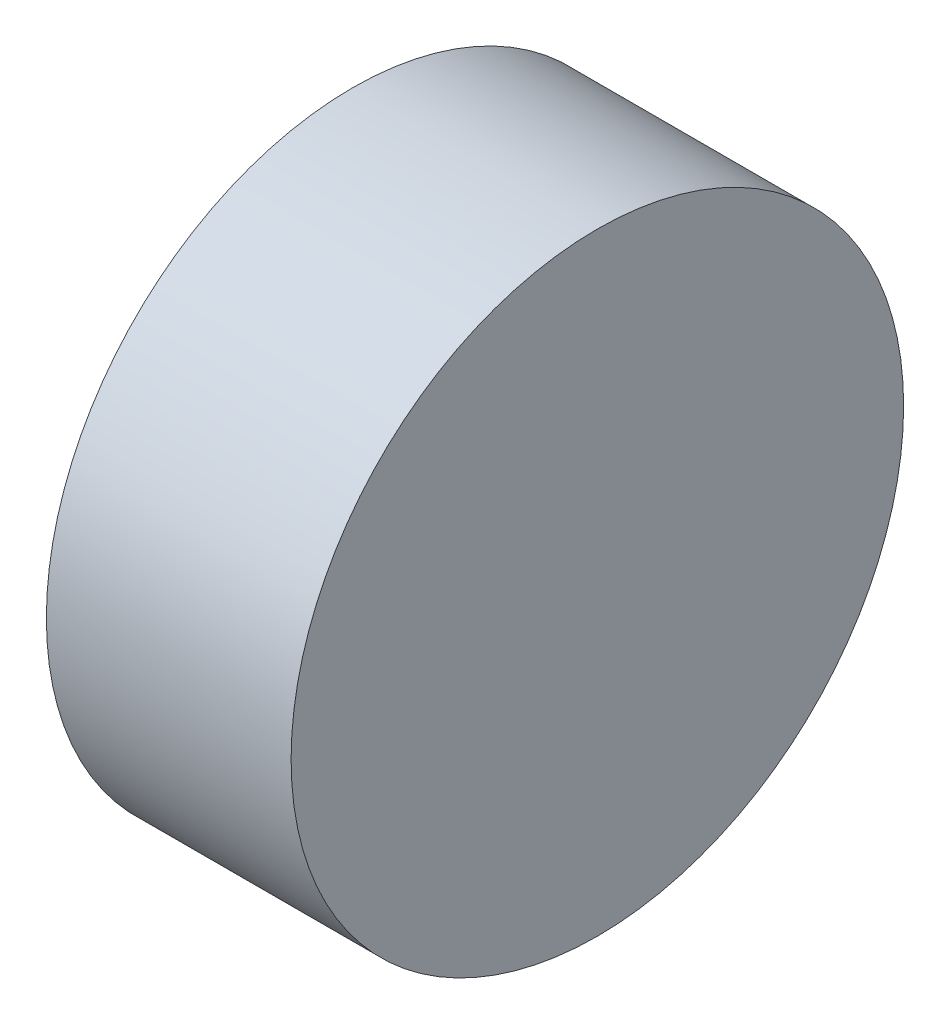
ISO-10303-21;
HEADER;
FILE_DESCRIPTION(('STEP AP214'),'2;1');
FILE_NAME('part.step','',(''),(''),'','','');
FILE_SCHEMA(('AUTOMOTIVE_DESIGN { 1 0 10303 214 1 1 1 1 }'));
ENDSEC;
DATA;
#1=APPLICATION_CONTEXT('core data for automotive mechanical design processes');
#2=APPLICATION_PROTOCOL_DEFINITION('international standard','automotive_design',2000,#1);
#3=PRODUCT_CONTEXT('',#1,'mechanical');
#4=PRODUCT('Part','Part','',(#3));
#5=PRODUCT_RELATED_PRODUCT_CATEGORY('part','',(#4));
#6=PRODUCT_DEFINITION_FORMATION('','',#4);
#7=PRODUCT_DEFINITION_CONTEXT('part definition',#1,'design');
#8=PRODUCT_DEFINITION('design','',#6,#7);
#9=PRODUCT_DEFINITION_SHAPE('','',#8);
#10=(LENGTH_UNIT() NAMED_UNIT(*) SI_UNIT(.MILLI.,.METRE.));
#11=(NAMED_UNIT(*) PLANE_ANGLE_UNIT() SI_UNIT($,.RADIAN.));
#12=(NAMED_UNIT(*) SI_UNIT($,.STERADIAN.) SOLID_ANGLE_UNIT());
#13=UNCERTAINTY_MEASURE_WITH_UNIT(LENGTH_MEASURE(1.E-05),#10,'distance_accuracy_value','');
#14=(GEOMETRIC_REPRESENTATION_CONTEXT(3) GLOBAL_UNCERTAINTY_ASSIGNED_CONTEXT((#13)) GLOBAL_UNIT_ASSIGNED_CONTEXT((#10,
#11,#12)) REPRESENTATION_CONTEXT('',''));
#15=CARTESIAN_POINT('',(0.,0.,0.));
#16=DIRECTION('',(0.,0.,1.));
#17=DIRECTION('',(1.,0.,0.));
#18=AXIS2_PLACEMENT_3D('',#15,#16,#17);
#19=CARTESIAN_POINT('',(17.1,0.,0.));
#20=DIRECTION('',(-1.,0.,0.));
#21=DIRECTION('',(0.,0.,1.));
#22=AXIS2_PLACEMENT_3D('',#19,#20,#21);
#23=CYLINDRICAL_SURFACE('',#22,21.4);
#24=CARTESIAN_POINT('',(17.1,0.,0.));
#25=DIRECTION('',(1.,0.,0.));
#26=DIRECTION('',(0.,0.,-1.));
#27=AXIS2_PLACEMENT_3D('',#24,#25,#26);
#28=CIRCLE('',#27,21.4);
#29=CARTESIAN_POINT('',(17.1,0.,-21.3999999999999));
#30=VERTEX_POINT('',#29);
#31=EDGE_CURVE('E10',#30,#30,#28,.T.);
#32=ORIENTED_EDGE('',*,*,#31,.F.);
#33=EDGE_LOOP('',(#32));
#34=FACE_BOUND('',#33,.T.);
#35=CARTESIAN_POINT('',(0.,0.,0.));
#36=DIRECTION('',(1.,0.,0.));
#37=DIRECTION('',(0.,0.,-1.));
#38=AXIS2_PLACEMENT_3D('',#35,#36,#37);
#39=CIRCLE('',#38,21.4);
#40=CARTESIAN_POINT('',(0.,0.,-21.4));
#41=VERTEX_POINT('',#40);
#42=EDGE_CURVE('E31',#41,#41,#39,.T.);
#43=ORIENTED_EDGE('',*,*,#42,.T.);
#44=EDGE_LOOP('',(#43));
#45=FACE_BOUND('',#44,.T.);
#46=ADVANCED_FACE('F28',(#34,#45),#23,.T.);
#47=CARTESIAN_POINT('',(17.1,0.,0.));
#48=DIRECTION('',(1.,0.,0.));
#49=DIRECTION('',(0.,0.,-1.));
#50=AXIS2_PLACEMENT_3D('',#47,#48,#49);
#51=PLANE('',#50);
#52=ORIENTED_EDGE('',*,*,#31,.T.);
#53=EDGE_LOOP('',(#52));
#54=FACE_BOUND('',#53,.T.);
#55=ADVANCED_FACE('F43',(#54),#51,.T.);
#56=CARTESIAN_POINT('',(0.,0.,0.));
#57=DIRECTION('',(1.,0.,0.));
#58=DIRECTION('',(0.,0.,-1.));
#59=AXIS2_PLACEMENT_3D('',#56,#57,#58);
#60=PLANE('',#59);
#61=ORIENTED_EDGE('',*,*,#42,.F.);
#62=EDGE_LOOP('',(#61));
#63=FACE_BOUND('',#62,.T.);
#64=ADVANCED_FACE('F41',(#63),#60,.F.);
#65=CLOSED_SHELL('',(#46,#55,#64));
#66=MANIFOLD_SOLID_BREP('B2',#65);
#67=ADVANCED_BREP_SHAPE_REPRESENTATION('',(#18,#66),#14);
#68=SHAPE_DEFINITION_REPRESENTATION(#9,#67);
ENDSEC;
END-ISO-10303-21;
